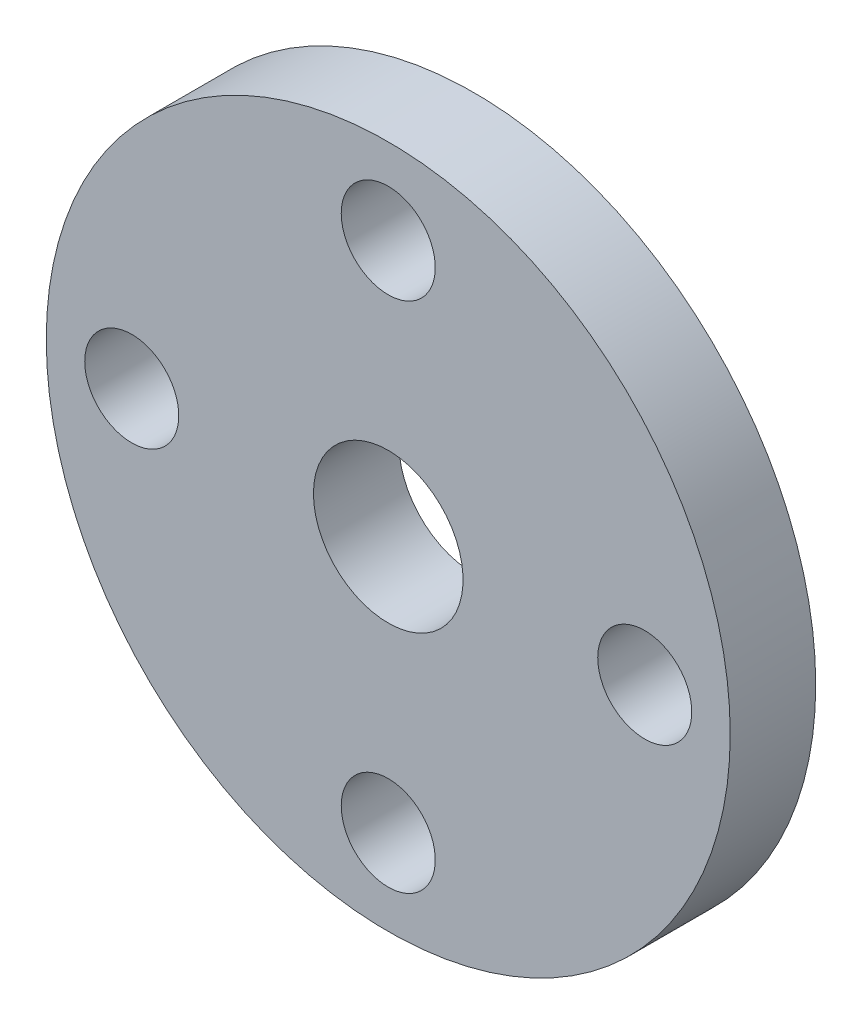
ISO-10303-21;
HEADER;
FILE_DESCRIPTION(('STEP AP214'),'2;1');
FILE_NAME('part.step','',(''),(''),'','','');
FILE_SCHEMA(('AUTOMOTIVE_DESIGN { 1 0 10303 214 1 1 1 1 }'));
ENDSEC;
DATA;
#1=APPLICATION_CONTEXT('core data for automotive mechanical design processes');
#2=APPLICATION_PROTOCOL_DEFINITION('international standard','automotive_design',2000,#1);
#3=PRODUCT_CONTEXT('',#1,'mechanical');
#4=PRODUCT('Part','Part','',(#3));
#5=PRODUCT_RELATED_PRODUCT_CATEGORY('part','',(#4));
#6=PRODUCT_DEFINITION_FORMATION('','',#4);
#7=PRODUCT_DEFINITION_CONTEXT('part definition',#1,'design');
#8=PRODUCT_DEFINITION('design','',#6,#7);
#9=PRODUCT_DEFINITION_SHAPE('','',#8);
#10=(LENGTH_UNIT() NAMED_UNIT(*) SI_UNIT(.MILLI.,.METRE.));
#11=(NAMED_UNIT(*) PLANE_ANGLE_UNIT() SI_UNIT($,.RADIAN.));
#12=(NAMED_UNIT(*) SI_UNIT($,.STERADIAN.) SOLID_ANGLE_UNIT());
#13=UNCERTAINTY_MEASURE_WITH_UNIT(LENGTH_MEASURE(1.E-05),#10,'distance_accuracy_value','');
#14=(GEOMETRIC_REPRESENTATION_CONTEXT(3) GLOBAL_UNCERTAINTY_ASSIGNED_CONTEXT((#13)) GLOBAL_UNIT_ASSIGNED_CONTEXT((#10,
#11,#12)) REPRESENTATION_CONTEXT('',''));
#15=CARTESIAN_POINT('',(0.,0.,0.));
#16=DIRECTION('',(0.,0.,1.));
#17=DIRECTION('',(1.,0.,0.));
#18=AXIS2_PLACEMENT_3D('',#15,#16,#17);
#19=CARTESIAN_POINT('',(0.,0.,2.));
#20=DIRECTION('',(0.,0.,-1.));
#21=DIRECTION('',(-1.,0.,0.));
#22=AXIS2_PLACEMENT_3D('',#19,#20,#21);
#23=CYLINDRICAL_SURFACE('',#22,8.);
#24=CARTESIAN_POINT('',(0.,0.,2.));
#25=DIRECTION('',(0.,0.,1.));
#26=DIRECTION('',(1.,0.,0.));
#27=AXIS2_PLACEMENT_3D('',#24,#25,#26);
#28=CIRCLE('',#27,8.);
#29=CARTESIAN_POINT('',(8.,0.,2.));
#30=VERTEX_POINT('',#29);
#31=EDGE_CURVE('E10',#30,#30,#28,.T.);
#32=ORIENTED_EDGE('',*,*,#31,.F.);
#33=EDGE_LOOP('',(#32));
#34=FACE_BOUND('',#33,.T.);
#35=CARTESIAN_POINT('',(0.,0.,0.));
#36=DIRECTION('',(0.,0.,1.));
#37=DIRECTION('',(1.,0.,0.));
#38=AXIS2_PLACEMENT_3D('',#35,#36,#37);
#39=CIRCLE('',#38,8.);
#40=CARTESIAN_POINT('',(8.,0.,0.));
#41=VERTEX_POINT('',#40);
#42=EDGE_CURVE('E40',#41,#41,#39,.T.);
#43=ORIENTED_EDGE('',*,*,#42,.T.);
#44=EDGE_LOOP('',(#43));
#45=FACE_BOUND('',#44,.T.);
#46=ADVANCED_FACE('F37',(#34,#45),#23,.T.);
#47=CARTESIAN_POINT('',(0.,0.,2.));
#48=DIRECTION('',(0.,0.,1.));
#49=DIRECTION('',(1.,0.,0.));
#50=AXIS2_PLACEMENT_3D('',#47,#48,#49);
#51=PLANE('',#50);
#52=CARTESIAN_POINT('',(0.,6.,2.));
#53=DIRECTION('',(0.,0.,-1.));
#54=DIRECTION('',(-1.,0.,0.));
#55=AXIS2_PLACEMENT_3D('',#52,#53,#54);
#56=CIRCLE('',#55,1.1);
#57=CARTESIAN_POINT('',(-1.1,6.,2.));
#58=VERTEX_POINT('',#57);
#59=EDGE_CURVE('E49',#58,#58,#56,.T.);
#60=ORIENTED_EDGE('',*,*,#59,.T.);
#61=EDGE_LOOP('',(#60));
#62=FACE_BOUND('',#61,.T.);
#63=CARTESIAN_POINT('',(0.,0.,2.));
#64=DIRECTION('',(0.,0.,-1.));
#65=DIRECTION('',(-1.,0.,0.));
#66=AXIS2_PLACEMENT_3D('',#63,#64,#65);
#67=CIRCLE('',#66,1.75);
#68=CARTESIAN_POINT('',(-1.75,0.,2.));
#69=VERTEX_POINT('',#68);
#70=EDGE_CURVE('E73',#69,#69,#67,.T.);
#71=ORIENTED_EDGE('',*,*,#70,.T.);
#72=EDGE_LOOP('',(#71));
#73=FACE_BOUND('',#72,.T.);
#74=CARTESIAN_POINT('',(6.,0.,2.));
#75=DIRECTION('',(0.,0.,-1.));
#76=DIRECTION('',(-1.,0.,0.));
#77=AXIS2_PLACEMENT_3D('',#74,#75,#76);
#78=CIRCLE('',#77,1.1);
#79=CARTESIAN_POINT('',(4.9,0.,2.));
#80=VERTEX_POINT('',#79);
#81=EDGE_CURVE('E56',#80,#80,#78,.T.);
#82=ORIENTED_EDGE('',*,*,#81,.T.);
#83=EDGE_LOOP('',(#82));
#84=FACE_BOUND('',#83,.T.);
#85=CARTESIAN_POINT('',(0.,-6.,2.));
#86=DIRECTION('',(0.,0.,-1.));
#87=DIRECTION('',(-1.,0.,0.));
#88=AXIS2_PLACEMENT_3D('',#85,#86,#87);
#89=CIRCLE('',#88,1.1);
#90=CARTESIAN_POINT('',(-1.1,-6.,2.));
#91=VERTEX_POINT('',#90);
#92=EDGE_CURVE('E55',#91,#91,#89,.T.);
#93=ORIENTED_EDGE('',*,*,#92,.T.);
#94=EDGE_LOOP('',(#93));
#95=FACE_BOUND('',#94,.T.);
#96=CARTESIAN_POINT('',(-6.,0.,2.));
#97=DIRECTION('',(0.,0.,-1.));
#98=DIRECTION('',(-1.,0.,0.));
#99=AXIS2_PLACEMENT_3D('',#96,#97,#98);
#100=CIRCLE('',#99,1.1);
#101=CARTESIAN_POINT('',(-7.1,0.,2.));
#102=VERTEX_POINT('',#101);
#103=EDGE_CURVE('E64',#102,#102,#100,.T.);
#104=ORIENTED_EDGE('',*,*,#103,.T.);
#105=EDGE_LOOP('',(#104));
#106=FACE_BOUND('',#105,.T.);
#107=ORIENTED_EDGE('',*,*,#31,.T.);
#108=EDGE_LOOP('',(#107));
#109=FACE_BOUND('',#108,.T.);
#110=ADVANCED_FACE('F91',(#62,#73,#84,#95,#106,#109),#51,.T.);
#111=CARTESIAN_POINT('',(0.,0.,0.));
#112=DIRECTION('',(0.,0.,1.));
#113=DIRECTION('',(1.,0.,0.));
#114=AXIS2_PLACEMENT_3D('',#111,#112,#113);
#115=PLANE('',#114);
#116=CARTESIAN_POINT('',(0.,6.,0.));
#117=DIRECTION('',(0.,0.,-1.));
#118=DIRECTION('',(-1.,0.,0.));
#119=AXIS2_PLACEMENT_3D('',#116,#117,#118);
#120=CIRCLE('',#119,1.1);
#121=CARTESIAN_POINT('',(-1.1,6.,0.));
#122=VERTEX_POINT('',#121);
#123=EDGE_CURVE('E68',#122,#122,#120,.T.);
#124=ORIENTED_EDGE('',*,*,#123,.F.);
#125=EDGE_LOOP('',(#124));
#126=FACE_BOUND('',#125,.T.);
#127=CARTESIAN_POINT('',(0.,0.,0.));
#128=DIRECTION('',(0.,0.,-1.));
#129=DIRECTION('',(-1.,0.,0.));
#130=AXIS2_PLACEMENT_3D('',#127,#128,#129);
#131=CIRCLE('',#130,1.75);
#132=CARTESIAN_POINT('',(-1.75,0.,0.));
#133=VERTEX_POINT('',#132);
#134=EDGE_CURVE('E69',#133,#133,#131,.T.);
#135=ORIENTED_EDGE('',*,*,#134,.F.);
#136=EDGE_LOOP('',(#135));
#137=FACE_BOUND('',#136,.T.);
#138=CARTESIAN_POINT('',(6.,0.,0.));
#139=DIRECTION('',(0.,0.,-1.));
#140=DIRECTION('',(-1.,0.,0.));
#141=AXIS2_PLACEMENT_3D('',#138,#139,#140);
#142=CIRCLE('',#141,1.1);
#143=CARTESIAN_POINT('',(4.9,0.,0.));
#144=VERTEX_POINT('',#143);
#145=EDGE_CURVE('E77',#144,#144,#142,.T.);
#146=ORIENTED_EDGE('',*,*,#145,.F.);
#147=EDGE_LOOP('',(#146));
#148=FACE_BOUND('',#147,.T.);
#149=CARTESIAN_POINT('',(0.,-6.,0.));
#150=DIRECTION('',(0.,0.,-1.));
#151=DIRECTION('',(-1.,0.,0.));
#152=AXIS2_PLACEMENT_3D('',#149,#150,#151);
#153=CIRCLE('',#152,1.1);
#154=CARTESIAN_POINT('',(-1.1,-6.,0.));
#155=VERTEX_POINT('',#154);
#156=EDGE_CURVE('E51',#155,#155,#153,.T.);
#157=ORIENTED_EDGE('',*,*,#156,.F.);
#158=EDGE_LOOP('',(#157));
#159=FACE_BOUND('',#158,.T.);
#160=CARTESIAN_POINT('',(-6.,0.,0.));
#161=DIRECTION('',(0.,0.,-1.));
#162=DIRECTION('',(-1.,0.,0.));
#163=AXIS2_PLACEMENT_3D('',#160,#161,#162);
#164=CIRCLE('',#163,1.1);
#165=CARTESIAN_POINT('',(-7.1,0.,0.));
#166=VERTEX_POINT('',#165);
#167=EDGE_CURVE('E60',#166,#166,#164,.T.);
#168=ORIENTED_EDGE('',*,*,#167,.F.);
#169=EDGE_LOOP('',(#168));
#170=FACE_BOUND('',#169,.T.);
#171=ORIENTED_EDGE('',*,*,#42,.F.);
#172=EDGE_LOOP('',(#171));
#173=FACE_BOUND('',#172,.T.);
#174=ADVANCED_FACE('F101',(#126,#137,#148,#159,#170,#173),#115,.F.);
#175=CARTESIAN_POINT('',(-6.,0.,2.));
#176=DIRECTION('',(0.,0.,-1.));
#177=DIRECTION('',(-1.,0.,0.));
#178=AXIS2_PLACEMENT_3D('',#175,#176,#177);
#179=CYLINDRICAL_SURFACE('',#178,1.1);
#180=ORIENTED_EDGE('',*,*,#103,.F.);
#181=EDGE_LOOP('',(#180));
#182=FACE_BOUND('',#181,.T.);
#183=ORIENTED_EDGE('',*,*,#167,.T.);
#184=EDGE_LOOP('',(#183));
#185=FACE_BOUND('',#184,.T.);
#186=ADVANCED_FACE('F104',(#182,#185),#179,.F.);
#187=CARTESIAN_POINT('',(0.,-6.,2.));
#188=DIRECTION('',(0.,0.,-1.));
#189=DIRECTION('',(-1.,0.,0.));
#190=AXIS2_PLACEMENT_3D('',#187,#188,#189);
#191=CYLINDRICAL_SURFACE('',#190,1.1);
#192=ORIENTED_EDGE('',*,*,#92,.F.);
#193=EDGE_LOOP('',(#192));
#194=FACE_BOUND('',#193,.T.);
#195=ORIENTED_EDGE('',*,*,#156,.T.);
#196=EDGE_LOOP('',(#195));
#197=FACE_BOUND('',#196,.T.);
#198=ADVANCED_FACE('F124',(#194,#197),#191,.F.);
#199=CARTESIAN_POINT('',(6.,0.,2.));
#200=DIRECTION('',(0.,0.,-1.));
#201=DIRECTION('',(-1.,0.,0.));
#202=AXIS2_PLACEMENT_3D('',#199,#200,#201);
#203=CYLINDRICAL_SURFACE('',#202,1.1);
#204=ORIENTED_EDGE('',*,*,#81,.F.);
#205=EDGE_LOOP('',(#204));
#206=FACE_BOUND('',#205,.T.);
#207=ORIENTED_EDGE('',*,*,#145,.T.);
#208=EDGE_LOOP('',(#207));
#209=FACE_BOUND('',#208,.T.);
#210=ADVANCED_FACE('F127',(#206,#209),#203,.F.);
#211=CARTESIAN_POINT('',(0.,0.,2.));
#212=DIRECTION('',(0.,0.,-1.));
#213=DIRECTION('',(-1.,0.,0.));
#214=AXIS2_PLACEMENT_3D('',#211,#212,#213);
#215=CYLINDRICAL_SURFACE('',#214,1.75);
#216=ORIENTED_EDGE('',*,*,#70,.F.);
#217=EDGE_LOOP('',(#216));
#218=FACE_BOUND('',#217,.T.);
#219=ORIENTED_EDGE('',*,*,#134,.T.);
#220=EDGE_LOOP('',(#219));
#221=FACE_BOUND('',#220,.T.);
#222=ADVANCED_FACE('F97',(#218,#221),#215,.F.);
#223=CARTESIAN_POINT('',(0.,6.,2.));
#224=DIRECTION('',(0.,0.,-1.));
#225=DIRECTION('',(-1.,0.,0.));
#226=AXIS2_PLACEMENT_3D('',#223,#224,#225);
#227=CYLINDRICAL_SURFACE('',#226,1.1);
#228=ORIENTED_EDGE('',*,*,#59,.F.);
#229=EDGE_LOOP('',(#228));
#230=FACE_BOUND('',#229,.T.);
#231=ORIENTED_EDGE('',*,*,#123,.T.);
#232=EDGE_LOOP('',(#231));
#233=FACE_BOUND('',#232,.T.);
#234=ADVANCED_FACE('F94',(#230,#233),#227,.F.);
#235=CLOSED_SHELL('',(#46,#110,#174,#186,#198,#210,#222,#234));
#236=MANIFOLD_SOLID_BREP('B2',#235);
#237=ADVANCED_BREP_SHAPE_REPRESENTATION('',(#18,#236),#14);
#238=SHAPE_DEFINITION_REPRESENTATION(#9,#237);
ENDSEC;
END-ISO-10303-21;
